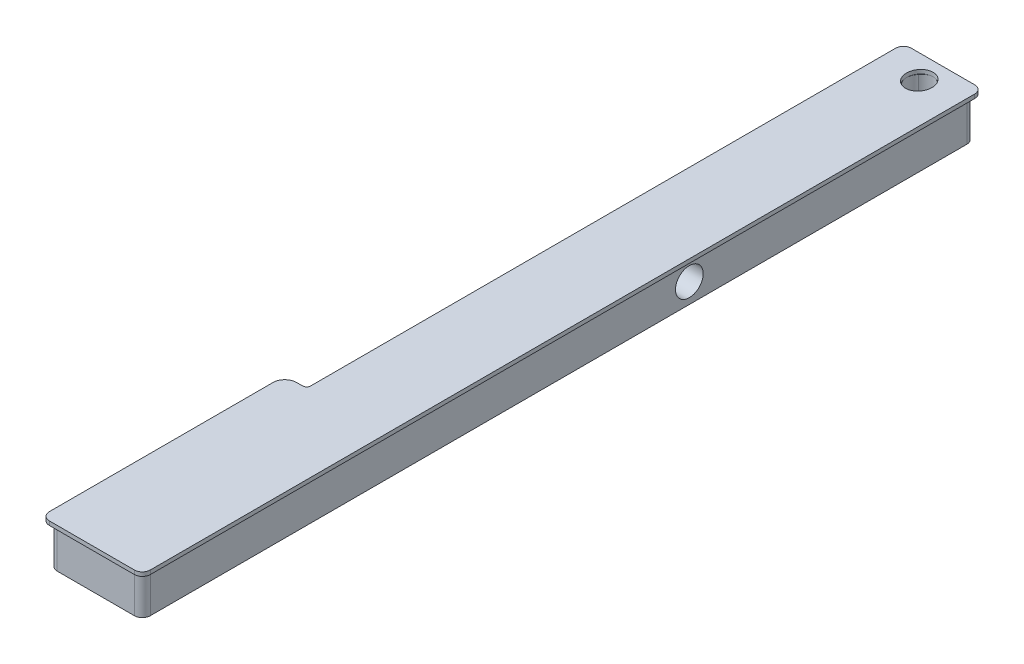
ISO-10303-21;
HEADER;
FILE_DESCRIPTION(('STEP AP214'),'2;1');
FILE_NAME('part.step','',(''),(''),'','','');
FILE_SCHEMA(('AUTOMOTIVE_DESIGN { 1 0 10303 214 1 1 1 1 }'));
ENDSEC;
DATA;
#1=APPLICATION_CONTEXT('core data for automotive mechanical design processes');
#2=APPLICATION_PROTOCOL_DEFINITION('international standard','automotive_design',2000,#1);
#3=PRODUCT_CONTEXT('',#1,'mechanical');
#4=PRODUCT('Part','Part','',(#3));
#5=PRODUCT_RELATED_PRODUCT_CATEGORY('part','',(#4));
#6=PRODUCT_DEFINITION_FORMATION('','',#4);
#7=PRODUCT_DEFINITION_CONTEXT('part definition',#1,'design');
#8=PRODUCT_DEFINITION('design','',#6,#7);
#9=PRODUCT_DEFINITION_SHAPE('','',#8);
#10=(LENGTH_UNIT() NAMED_UNIT(*) SI_UNIT(.MILLI.,.METRE.));
#11=(NAMED_UNIT(*) PLANE_ANGLE_UNIT() SI_UNIT($,.RADIAN.));
#12=(NAMED_UNIT(*) SI_UNIT($,.STERADIAN.) SOLID_ANGLE_UNIT());
#13=UNCERTAINTY_MEASURE_WITH_UNIT(LENGTH_MEASURE(1.E-05),#10,'distance_accuracy_value','');
#14=(GEOMETRIC_REPRESENTATION_CONTEXT(3) GLOBAL_UNCERTAINTY_ASSIGNED_CONTEXT((#13)) GLOBAL_UNIT_ASSIGNED_CONTEXT((#10,
#11,#12)) REPRESENTATION_CONTEXT('',''));
#15=CARTESIAN_POINT('',(0.,0.,0.));
#16=DIRECTION('',(0.,0.,1.));
#17=DIRECTION('',(1.,0.,0.));
#18=AXIS2_PLACEMENT_3D('',#15,#16,#17);
#19=CARTESIAN_POINT('',(2.35403461780498,0.,-136.));
#20=DIRECTION('',(0.,1.,0.));
#21=DIRECTION('',(0.,0.,1.));
#22=AXIS2_PLACEMENT_3D('',#19,#20,#21);
#23=CYLINDRICAL_SURFACE('',#22,3.2);
#24=CARTESIAN_POINT('',(2.35403461780498,10.,-136.));
#25=DIRECTION('',(0.,-1.,0.));
#26=DIRECTION('',(0.,0.,-1.));
#27=AXIS2_PLACEMENT_3D('',#24,#25,#26);
#28=CIRCLE('',#27,3.2);
#29=CARTESIAN_POINT('',(-0.00523515188092811,10.,-138.161907989218));
#30=VERTEX_POINT('',#29);
#31=CARTESIAN_POINT('',(-0.845965382195017,10.,-136.));
#32=VERTEX_POINT('',#31);
#33=EDGE_CURVE('E50',#30,#32,#28,.F.);
#34=ORIENTED_EDGE('',*,*,#33,.T.);
#35=CARTESIAN_POINT('',(-0.00523515188097972,10.,-133.838092010782));
#36=VERTEX_POINT('',#35);
#37=EDGE_CURVE('E11',#32,#36,#28,.F.);
#38=ORIENTED_EDGE('',*,*,#37,.T.);
#39=DIRECTION('',(0.,1.,0.));
#40=VECTOR('',#39,1.);
#41=CARTESIAN_POINT('',(-0.00523515188092594,0.,-133.838092010782));
#42=LINE('',#41,#40);
#43=CARTESIAN_POINT('',(-0.00523515188092507,0.,-133.838092010782));
#44=VERTEX_POINT('',#43);
#45=EDGE_CURVE('E273',#44,#36,#42,.T.);
#46=ORIENTED_EDGE('',*,*,#45,.F.);
#47=CARTESIAN_POINT('',(2.35403461780498,0.,-136.));
#48=DIRECTION('',(0.,1.,0.));
#49=DIRECTION('',(0.,0.,1.));
#50=AXIS2_PLACEMENT_3D('',#47,#48,#49);
#51=CIRCLE('',#50,3.2);
#52=CARTESIAN_POINT('',(-0.00523515188092637,0.,-138.161907989218));
#53=VERTEX_POINT('',#52);
#54=EDGE_CURVE('E289',#53,#44,#51,.T.);
#55=ORIENTED_EDGE('',*,*,#54,.F.);
#56=DIRECTION('',(0.,1.,0.));
#57=VECTOR('',#56,1.);
#58=CARTESIAN_POINT('',(-0.00523515188092637,0.,-138.161907989218));
#59=LINE('',#58,#57);
#60=EDGE_CURVE('E496',#30,#53,#59,.F.);
#61=ORIENTED_EDGE('',*,*,#60,.F.);
#62=EDGE_LOOP('',(#34,#38,#46,#55,#61));
#63=FACE_BOUND('',#62,.T.);
#64=ADVANCED_FACE('F41',(#63),#23,.F.);
#65=CARTESIAN_POINT('',(0.,11.,0.));
#66=DIRECTION('',(0.,1.,0.));
#67=DIRECTION('',(0.,0.,1.));
#68=AXIS2_PLACEMENT_3D('',#65,#66,#67);
#69=PLANE('',#68);
#70=CARTESIAN_POINT('',(2.35403461780498,11.,-136.));
#71=DIRECTION('',(0.,-1.,0.));
#72=DIRECTION('',(0.,0.,1.));
#73=AXIS2_PLACEMENT_3D('',#70,#71,#72);
#74=ELLIPSE('',#73,3.5,3.2);
#75=CARTESIAN_POINT('',(2.35403461780498,11.,-132.5));
#76=VERTEX_POINT('',#75);
#77=EDGE_CURVE('E252',#76,#76,#74,.F.);
#78=ORIENTED_EDGE('',*,*,#77,.F.);
#79=EDGE_LOOP('',(#78));
#80=FACE_BOUND('',#79,.T.);
#81=DIRECTION('',(0.,0.,1.));
#82=VECTOR('',#81,1.);
#83=CARTESIAN_POINT('',(-13.135965382195,11.,-142.));
#84=LINE('',#83,#82);
#85=CARTESIAN_POINT('',(-13.135965382195,11.,11.5658663131515));
#86=VERTEX_POINT('',#85);
#87=CARTESIAN_POINT('',(-13.135965382195,11.,68.));
#88=VERTEX_POINT('',#87);
#89=EDGE_CURVE('E532',#86,#88,#84,.T.);
#90=ORIENTED_EDGE('',*,*,#89,.T.);
#91=CARTESIAN_POINT('',(-11.135965382195,11.,68.));
#92=DIRECTION('',(0.,1.,0.));
#93=DIRECTION('',(0.,0.,1.));
#94=AXIS2_PLACEMENT_3D('',#91,#92,#93);
#95=CIRCLE('',#94,2.);
#96=CARTESIAN_POINT('',(-11.135965382195,11.,70.));
#97=VERTEX_POINT('',#96);
#98=EDGE_CURVE('E482',#88,#97,#95,.T.);
#99=ORIENTED_EDGE('',*,*,#98,.T.);
#100=DIRECTION('',(-1.,0.,0.));
#101=VECTOR('',#100,1.);
#102=CARTESIAN_POINT('',(12.344034617805,11.,70.));
#103=LINE('',#102,#101);
#104=CARTESIAN_POINT('',(10.344034617805,11.,70.));
#105=VERTEX_POINT('',#104);
#106=EDGE_CURVE('E536',#105,#97,#103,.T.);
#107=ORIENTED_EDGE('',*,*,#106,.F.);
#108=CARTESIAN_POINT('',(10.344034617805,11.,68.));
#109=DIRECTION('',(0.,1.,0.));
#110=DIRECTION('',(0.,0.,1.));
#111=AXIS2_PLACEMENT_3D('',#108,#109,#110);
#112=CIRCLE('',#111,2.);
#113=CARTESIAN_POINT('',(12.344034617805,11.,68.));
#114=VERTEX_POINT('',#113);
#115=EDGE_CURVE('E480',#105,#114,#112,.T.);
#116=ORIENTED_EDGE('',*,*,#115,.T.);
#117=DIRECTION('',(0.,0.,1.));
#118=VECTOR('',#117,1.);
#119=CARTESIAN_POINT('',(12.344034617805,11.,-142.));
#120=LINE('',#119,#118);
#121=CARTESIAN_POINT('',(12.344034617805,11.,-140.));
#122=VERTEX_POINT('',#121);
#123=EDGE_CURVE('E539',#122,#114,#120,.T.);
#124=ORIENTED_EDGE('',*,*,#123,.F.);
#125=CARTESIAN_POINT('',(10.344034617805,11.,-140.));
#126=DIRECTION('',(0.,1.,0.));
#127=DIRECTION('',(0.,0.,1.));
#128=AXIS2_PLACEMENT_3D('',#125,#126,#127);
#129=CIRCLE('',#128,2.);
#130=CARTESIAN_POINT('',(10.344034617805,11.,-142.));
#131=VERTEX_POINT('',#130);
#132=EDGE_CURVE('E478',#122,#131,#129,.T.);
#133=ORIENTED_EDGE('',*,*,#132,.T.);
#134=DIRECTION('',(-1.,0.,0.));
#135=VECTOR('',#134,1.);
#136=CARTESIAN_POINT('',(12.344034617805,11.,-142.));
#137=LINE('',#136,#135);
#138=CARTESIAN_POINT('',(-5.63596538219501,11.,-142.));
#139=VERTEX_POINT('',#138);
#140=EDGE_CURVE('E530',#131,#139,#137,.T.);
#141=ORIENTED_EDGE('',*,*,#140,.T.);
#142=CARTESIAN_POINT('',(-5.63596538219501,11.,-140.));
#143=DIRECTION('',(0.,1.,0.));
#144=DIRECTION('',(0.,0.,1.));
#145=AXIS2_PLACEMENT_3D('',#142,#143,#144);
#146=CIRCLE('',#145,2.);
#147=CARTESIAN_POINT('',(-7.63596538219501,11.,-140.));
#148=VERTEX_POINT('',#147);
#149=EDGE_CURVE('E57',#139,#148,#146,.T.);
#150=ORIENTED_EDGE('',*,*,#149,.T.);
#151=DIRECTION('',(0.,0.,-1.));
#152=VECTOR('',#151,1.);
#153=CARTESIAN_POINT('',(-7.63596538219501,11.,0.));
#154=LINE('',#153,#152);
#155=CARTESIAN_POINT('',(-7.63596538219501,11.,7.56586631315154));
#156=VERTEX_POINT('',#155);
#157=EDGE_CURVE('E515',#156,#148,#154,.T.);
#158=ORIENTED_EDGE('',*,*,#157,.F.);
#159=CARTESIAN_POINT('',(-8.63596538219502,11.,7.56586631315152));
#160=DIRECTION('',(0.,1.,0.));
#161=DIRECTION('',(0.,0.,1.));
#162=AXIS2_PLACEMENT_3D('',#159,#160,#161);
#163=CIRCLE('',#162,1.00000000000002);
#164=CARTESIAN_POINT('',(-8.63596538219501,11.,8.56586631315154));
#165=VERTEX_POINT('',#164);
#166=EDGE_CURVE('E522',#165,#156,#163,.T.);
#167=ORIENTED_EDGE('',*,*,#166,.F.);
#168=DIRECTION('',(1.,0.,-2.40548322002117E-13));
#169=VECTOR('',#168,1.);
#170=CARTESIAN_POINT('',(2.06050476812256E-12,11.,8.56586631314946));
#171=LINE('',#170,#169);
#172=CARTESIAN_POINT('',(-10.135965382195,11.,8.5658663131519));
#173=VERTEX_POINT('',#172);
#174=EDGE_CURVE('E524',#173,#165,#171,.T.);
#175=ORIENTED_EDGE('',*,*,#174,.F.);
#176=CARTESIAN_POINT('',(-10.1359653821954,11.,11.5658663131515));
#177=DIRECTION('',(0.,1.,0.));
#178=DIRECTION('',(0.,0.,1.));
#179=AXIS2_PLACEMENT_3D('',#176,#177,#178);
#180=CIRCLE('',#179,2.99999999999964);
#181=EDGE_CURVE('E526',#173,#86,#180,.T.);
#182=ORIENTED_EDGE('',*,*,#181,.T.);
#183=EDGE_LOOP('',(#90,#99,#107,#116,#124,#133,#141,#150,#158,#167,#175,#182));
#184=FACE_BOUND('',#183,.T.);
#185=ADVANCED_FACE('F377',(#80,#184),#69,.T.);
#186=CARTESIAN_POINT('',(0.,10.,0.));
#187=DIRECTION('',(0.,1.,0.));
#188=DIRECTION('',(0.,0.,1.));
#189=AXIS2_PLACEMENT_3D('',#186,#187,#188);
#190=PLANE('',#189);
#191=DIRECTION('',(0.,0.,1.));
#192=VECTOR('',#191,1.);
#193=CARTESIAN_POINT('',(-6.63596538219501,10.,-69.));
#194=LINE('',#193,#192);
#195=CARTESIAN_POINT('',(-6.63596538219501,10.,-139.));
#196=VERTEX_POINT('',#195);
#197=CARTESIAN_POINT('',(-6.63596538219501,10.,7.56586631315154));
#198=VERTEX_POINT('',#197);
#199=EDGE_CURVE('E706',#196,#198,#194,.T.);
#200=ORIENTED_EDGE('',*,*,#199,.T.);
#201=CARTESIAN_POINT('',(-8.63596538219501,10.,7.56586631315154));
#202=DIRECTION('',(0.,1.,0.));
#203=DIRECTION('',(0.,0.,1.));
#204=AXIS2_PLACEMENT_3D('',#201,#202,#203);
#205=CIRCLE('',#204,2.);
#206=CARTESIAN_POINT('',(-8.63596538219501,10.,9.56586631315154));
#207=VERTEX_POINT('',#206);
#208=EDGE_CURVE('E445',#198,#207,#205,.F.);
#209=ORIENTED_EDGE('',*,*,#208,.T.);
#210=DIRECTION('',(-1.,0.,0.));
#211=VECTOR('',#210,1.);
#212=CARTESIAN_POINT('',(-6.63596538219501,10.,9.56586631315154));
#213=LINE('',#212,#211);
#214=CARTESIAN_POINT('',(-10.135965382195,10.,9.56586631315154));
#215=VERTEX_POINT('',#214);
#216=EDGE_CURVE('E722',#207,#215,#213,.T.);
#217=ORIENTED_EDGE('',*,*,#216,.T.);
#218=CARTESIAN_POINT('',(-10.135965382195,10.,11.5658663131515));
#219=DIRECTION('',(0.,1.,0.));
#220=DIRECTION('',(0.,0.,1.));
#221=AXIS2_PLACEMENT_3D('',#218,#219,#220);
#222=CIRCLE('',#221,2.);
#223=CARTESIAN_POINT('',(-12.135965382195,10.,11.5658663131515));
#224=VERTEX_POINT('',#223);
#225=EDGE_CURVE('E457',#215,#224,#222,.T.);
#226=ORIENTED_EDGE('',*,*,#225,.T.);
#227=DIRECTION('',(0.,0.,1.));
#228=VECTOR('',#227,1.);
#229=CARTESIAN_POINT('',(-12.135965382195,10.,9.56586631315154));
#230=LINE('',#229,#228);
#231=CARTESIAN_POINT('',(-12.135965382195,10.,67.));
#232=VERTEX_POINT('',#231);
#233=EDGE_CURVE('E744',#224,#232,#230,.T.);
#234=ORIENTED_EDGE('',*,*,#233,.T.);
#235=CARTESIAN_POINT('',(-10.135965382195,10.,67.));
#236=DIRECTION('',(0.,1.,0.));
#237=DIRECTION('',(0.,0.,1.));
#238=AXIS2_PLACEMENT_3D('',#235,#236,#237);
#239=CIRCLE('',#238,2.);
#240=CARTESIAN_POINT('',(-10.135965382195,10.,69.));
#241=VERTEX_POINT('',#240);
#242=EDGE_CURVE('E453',#232,#241,#239,.T.);
#243=ORIENTED_EDGE('',*,*,#242,.T.);
#244=DIRECTION('',(1.,0.,0.));
#245=VECTOR('',#244,1.);
#246=CARTESIAN_POINT('',(11.344034617805,10.,69.));
#247=LINE('',#246,#245);
#248=CARTESIAN_POINT('',(9.344034617805,10.,69.));
#249=VERTEX_POINT('',#248);
#250=EDGE_CURVE('E747',#241,#249,#247,.T.);
#251=ORIENTED_EDGE('',*,*,#250,.T.);
#252=CARTESIAN_POINT('',(9.344034617805,10.,67.));
#253=DIRECTION('',(0.,1.,0.));
#254=DIRECTION('',(0.,0.,1.));
#255=AXIS2_PLACEMENT_3D('',#252,#253,#254);
#256=CIRCLE('',#255,2.);
#257=CARTESIAN_POINT('',(11.344034617805,10.,67.));
#258=VERTEX_POINT('',#257);
#259=EDGE_CURVE('E451',#249,#258,#256,.T.);
#260=ORIENTED_EDGE('',*,*,#259,.T.);
#261=DIRECTION('',(0.,0.,-1.));
#262=VECTOR('',#261,1.);
#263=CARTESIAN_POINT('',(11.344034617805,10.,-69.));
#264=LINE('',#263,#262);
#265=CARTESIAN_POINT('',(11.344034617805,10.,-139.));
#266=VERTEX_POINT('',#265);
#267=EDGE_CURVE('E752',#258,#266,#264,.T.);
#268=ORIENTED_EDGE('',*,*,#267,.T.);
#269=CARTESIAN_POINT('',(9.34403461780498,10.,-139.));
#270=DIRECTION('',(0.,1.,0.));
#271=DIRECTION('',(0.,0.,1.));
#272=AXIS2_PLACEMENT_3D('',#269,#270,#271);
#273=CIRCLE('',#272,2.);
#274=CARTESIAN_POINT('',(9.34403461780498,10.,-141.));
#275=VERTEX_POINT('',#274);
#276=EDGE_CURVE('E449',#266,#275,#273,.T.);
#277=ORIENTED_EDGE('',*,*,#276,.T.);
#278=DIRECTION('',(-1.,0.,0.));
#279=VECTOR('',#278,1.);
#280=CARTESIAN_POINT('',(-6.63596538219501,10.,-141.));
#281=LINE('',#280,#279);
#282=CARTESIAN_POINT('',(-4.63596538219502,10.,-141.));
#283=VERTEX_POINT('',#282);
#284=EDGE_CURVE('E714',#275,#283,#281,.T.);
#285=ORIENTED_EDGE('',*,*,#284,.T.);
#286=CARTESIAN_POINT('',(-4.63596538219502,10.,-139.));
#287=DIRECTION('',(0.,1.,0.));
#288=DIRECTION('',(0.,0.,1.));
#289=AXIS2_PLACEMENT_3D('',#286,#287,#288);
#290=CIRCLE('',#289,2.);
#291=EDGE_CURVE('E447',#283,#196,#290,.T.);
#292=ORIENTED_EDGE('',*,*,#291,.T.);
#293=EDGE_LOOP('',(#200,#209,#217,#226,#234,#243,#251,#260,#268,#277,#285,#292));
#294=FACE_BOUND('',#293,.T.);
#295=DIRECTION('',(-1.,0.,0.));
#296=VECTOR('',#295,1.);
#297=CARTESIAN_POINT('',(12.344034617805,10.,70.));
#298=LINE('',#297,#296);
#299=CARTESIAN_POINT('',(10.344034617805,10.,70.));
#300=VERTEX_POINT('',#299);
#301=CARTESIAN_POINT('',(-11.135965382195,10.,70.));
#302=VERTEX_POINT('',#301);
#303=EDGE_CURVE('E547',#300,#302,#298,.T.);
#304=ORIENTED_EDGE('',*,*,#303,.T.);
#305=CARTESIAN_POINT('',(-11.135965382195,10.,68.));
#306=DIRECTION('',(0.,1.,0.));
#307=DIRECTION('',(0.,0.,1.));
#308=AXIS2_PLACEMENT_3D('',#305,#306,#307);
#309=CIRCLE('',#308,2.);
#310=CARTESIAN_POINT('',(-13.135965382195,10.,68.));
#311=VERTEX_POINT('',#310);
#312=EDGE_CURVE('E473',#302,#311,#309,.F.);
#313=ORIENTED_EDGE('',*,*,#312,.T.);
#314=DIRECTION('',(0.,0.,1.));
#315=VECTOR('',#314,1.);
#316=CARTESIAN_POINT('',(-13.135965382195,10.,-142.));
#317=LINE('',#316,#315);
#318=CARTESIAN_POINT('',(-13.135965382195,10.,11.5658663131515));
#319=VERTEX_POINT('',#318);
#320=EDGE_CURVE('E544',#319,#311,#317,.T.);
#321=ORIENTED_EDGE('',*,*,#320,.F.);
#322=CARTESIAN_POINT('',(-10.1359653821954,10.,11.5658663131515));
#323=DIRECTION('',(0.,-1.,0.));
#324=DIRECTION('',(0.,0.,-1.));
#325=AXIS2_PLACEMENT_3D('',#322,#323,#324);
#326=CIRCLE('',#325,2.99999999999964);
#327=CARTESIAN_POINT('',(-10.135965382195,10.,8.5658663131519));
#328=VERTEX_POINT('',#327);
#329=EDGE_CURVE('E508',#319,#328,#326,.T.);
#330=ORIENTED_EDGE('',*,*,#329,.T.);
#331=DIRECTION('',(-1.,0.,2.40548322002117E-13));
#332=VECTOR('',#331,1.);
#333=CARTESIAN_POINT('',(-8.63596538219501,10.,8.56586631315154));
#334=LINE('',#333,#332);
#335=CARTESIAN_POINT('',(-8.63596538219501,10.,8.56586631315154));
#336=VERTEX_POINT('',#335);
#337=EDGE_CURVE('E505',#336,#328,#334,.T.);
#338=ORIENTED_EDGE('',*,*,#337,.F.);
#339=CARTESIAN_POINT('',(-8.63596538219502,10.,7.56586631315152));
#340=DIRECTION('',(0.,-1.,0.));
#341=DIRECTION('',(0.,0.,-1.));
#342=AXIS2_PLACEMENT_3D('',#339,#340,#341);
#343=CIRCLE('',#342,1.00000000000002);
#344=CARTESIAN_POINT('',(-7.63596538219501,10.,7.56586631315154));
#345=VERTEX_POINT('',#344);
#346=EDGE_CURVE('E251',#345,#336,#343,.T.);
#347=ORIENTED_EDGE('',*,*,#346,.F.);
#348=DIRECTION('',(0.,0.,-1.));
#349=VECTOR('',#348,1.);
#350=CARTESIAN_POINT('',(-7.63596538219501,10.,0.));
#351=LINE('',#350,#349);
#352=CARTESIAN_POINT('',(-7.63596538219501,10.,-140.));
#353=VERTEX_POINT('',#352);
#354=EDGE_CURVE('E459',#345,#353,#351,.T.);
#355=ORIENTED_EDGE('',*,*,#354,.T.);
#356=CARTESIAN_POINT('',(-5.63596538219501,10.,-140.));
#357=DIRECTION('',(0.,1.,0.));
#358=DIRECTION('',(0.,0.,1.));
#359=AXIS2_PLACEMENT_3D('',#356,#357,#358);
#360=CIRCLE('',#359,2.);
#361=CARTESIAN_POINT('',(-5.63596538219501,10.,-142.));
#362=VERTEX_POINT('',#361);
#363=EDGE_CURVE('E467',#353,#362,#360,.F.);
#364=ORIENTED_EDGE('',*,*,#363,.T.);
#365=DIRECTION('',(-1.,0.,0.));
#366=VECTOR('',#365,1.);
#367=CARTESIAN_POINT('',(12.344034617805,10.,-142.));
#368=LINE('',#367,#366);
#369=CARTESIAN_POINT('',(10.344034617805,10.,-142.));
#370=VERTEX_POINT('',#369);
#371=EDGE_CURVE('E529',#370,#362,#368,.T.);
#372=ORIENTED_EDGE('',*,*,#371,.F.);
#373=CARTESIAN_POINT('',(10.344034617805,10.,-140.));
#374=DIRECTION('',(0.,1.,0.));
#375=DIRECTION('',(0.,0.,1.));
#376=AXIS2_PLACEMENT_3D('',#373,#374,#375);
#377=CIRCLE('',#376,2.);
#378=CARTESIAN_POINT('',(12.344034617805,10.,-140.));
#379=VERTEX_POINT('',#378);
#380=EDGE_CURVE('E469',#370,#379,#377,.F.);
#381=ORIENTED_EDGE('',*,*,#380,.T.);
#382=DIRECTION('',(0.,0.,1.));
#383=VECTOR('',#382,1.);
#384=CARTESIAN_POINT('',(12.344034617805,10.,-142.));
#385=LINE('',#384,#383);
#386=CARTESIAN_POINT('',(12.344034617805,10.,68.));
#387=VERTEX_POINT('',#386);
#388=EDGE_CURVE('E533',#379,#387,#385,.T.);
#389=ORIENTED_EDGE('',*,*,#388,.T.);
#390=CARTESIAN_POINT('',(10.344034617805,10.,68.));
#391=DIRECTION('',(0.,1.,0.));
#392=DIRECTION('',(0.,0.,1.));
#393=AXIS2_PLACEMENT_3D('',#390,#391,#392);
#394=CIRCLE('',#393,2.);
#395=EDGE_CURVE('E471',#387,#300,#394,.F.);
#396=ORIENTED_EDGE('',*,*,#395,.T.);
#397=EDGE_LOOP('',(#304,#313,#321,#330,#338,#347,#355,#364,#372,#381,#389,#396));
#398=FACE_BOUND('',#397,.T.);
#399=ADVANCED_FACE('F382',(#294,#398),#190,.F.);
#400=CARTESIAN_POINT('',(2.35403461780498,0.,-136.));
#401=DIRECTION('',(0.,1.,0.));
#402=DIRECTION('',(0.,0.,-1.));
#403=AXIS2_PLACEMENT_3D('',#400,#401,#402);
#404=ELLIPSE('',#403,3.5,3.);
#405=DIRECTION('',(0.,1.,0.));
#406=VECTOR('',#405,1.);
#407=SURFACE_OF_LINEAR_EXTRUSION('',#404,#406);
#408=CARTESIAN_POINT('',(2.35403461780498,10.,-136.));
#409=DIRECTION('',(0.,1.,0.));
#410=DIRECTION('',(0.,0.,-1.));
#411=AXIS2_PLACEMENT_3D('',#408,#409,#410);
#412=ELLIPSE('',#411,3.5,3.);
#413=CARTESIAN_POINT('',(2.35403461780498,10.,-132.5));
#414=VERTEX_POINT('',#413);
#415=EDGE_CURVE('E267',#36,#414,#412,.T.);
#416=ORIENTED_EDGE('',*,*,#415,.T.);
#417=CARTESIAN_POINT('',(2.35403461780498,10.,-136.));
#418=DIRECTION('',(0.,1.,0.));
#419=DIRECTION('',(0.,0.,-1.));
#420=AXIS2_PLACEMENT_3D('',#417,#418,#419);
#421=ELLIPSE('',#420,3.5,3.);
#422=CARTESIAN_POINT('',(4.7133043874909,10.,-133.838092010782));
#423=VERTEX_POINT('',#422);
#424=EDGE_CURVE('E240',#414,#423,#421,.T.);
#425=ORIENTED_EDGE('',*,*,#424,.T.);
#426=DIRECTION('',(0.,1.,0.));
#427=VECTOR('',#426,1.);
#428=CARTESIAN_POINT('',(4.7133043874909,0.,-133.838092010782));
#429=LINE('',#428,#427);
#430=CARTESIAN_POINT('',(4.7133043874909,0.,-133.838092010782));
#431=VERTEX_POINT('',#430);
#432=EDGE_CURVE('E395',#423,#431,#429,.F.);
#433=ORIENTED_EDGE('',*,*,#432,.T.);
#434=EDGE_CURVE('E279',#44,#431,#404,.T.);
#435=ORIENTED_EDGE('',*,*,#434,.F.);
#436=ORIENTED_EDGE('',*,*,#45,.T.);
#437=EDGE_LOOP('',(#416,#425,#433,#435,#436));
#438=FACE_BOUND('',#437,.T.);
#439=ADVANCED_FACE('F271',(#438),#407,.F.);
#440=CARTESIAN_POINT('',(-6.63596538219501,10.,9.56586631315154));
#441=DIRECTION('',(0.,0.,1.));
#442=DIRECTION('',(1.,0.,0.));
#443=AXIS2_PLACEMENT_3D('',#440,#441,#442);
#444=PLANE('',#443);
#445=ORIENTED_EDGE('',*,*,#216,.F.);
#446=DIRECTION('',(0.,-1.,0.));
#447=VECTOR('',#446,1.);
#448=CARTESIAN_POINT('',(-8.63596538219501,0.,9.56586631315154));
#449=LINE('',#448,#447);
#450=CARTESIAN_POINT('',(-8.63596538219501,0.,9.56586631315154));
#451=VERTEX_POINT('',#450);
#452=EDGE_CURVE('E442',#207,#451,#449,.T.);
#453=ORIENTED_EDGE('',*,*,#452,.T.);
#454=DIRECTION('',(-1.,0.,0.));
#455=VECTOR('',#454,1.);
#456=CARTESIAN_POINT('',(-6.63596538219501,0.,9.56586631315154));
#457=LINE('',#456,#455);
#458=CARTESIAN_POINT('',(-10.135965382195,0.,9.56586631315154));
#459=VERTEX_POINT('',#458);
#460=EDGE_CURVE('E720',#451,#459,#457,.T.);
#461=ORIENTED_EDGE('',*,*,#460,.T.);
#462=DIRECTION('',(0.,-1.,0.));
#463=VECTOR('',#462,1.);
#464=CARTESIAN_POINT('',(-10.135965382195,10.,9.56586631315154));
#465=LINE('',#464,#463);
#466=EDGE_CURVE('E440',#459,#215,#465,.F.);
#467=ORIENTED_EDGE('',*,*,#466,.T.);
#468=EDGE_LOOP('',(#445,#453,#461,#467));
#469=FACE_BOUND('',#468,.T.);
#470=ADVANCED_FACE('F329',(#469),#444,.F.);
#471=CARTESIAN_POINT('',(-12.135965382195,10.,9.56586631315154));
#472=DIRECTION('',(1.,0.,0.));
#473=DIRECTION('',(0.,0.,-1.));
#474=AXIS2_PLACEMENT_3D('',#471,#472,#473);
#475=PLANE('',#474);
#476=DIRECTION('',(0.,0.,1.));
#477=VECTOR('',#476,1.);
#478=CARTESIAN_POINT('',(-12.135965382195,0.,9.56586631315154));
#479=LINE('',#478,#477);
#480=CARTESIAN_POINT('',(-12.135965382195,0.,11.5658663131515));
#481=VERTEX_POINT('',#480);
#482=CARTESIAN_POINT('',(-12.135965382195,0.,67.));
#483=VERTEX_POINT('',#482);
#484=EDGE_CURVE('E727',#481,#483,#479,.T.);
#485=ORIENTED_EDGE('',*,*,#484,.T.);
#486=DIRECTION('',(0.,-1.,0.));
#487=VECTOR('',#486,1.);
#488=CARTESIAN_POINT('',(-12.135965382195,10.,67.));
#489=LINE('',#488,#487);
#490=EDGE_CURVE('E438',#483,#232,#489,.F.);
#491=ORIENTED_EDGE('',*,*,#490,.T.);
#492=ORIENTED_EDGE('',*,*,#233,.F.);
#493=DIRECTION('',(0.,-1.,0.));
#494=VECTOR('',#493,1.);
#495=CARTESIAN_POINT('',(-12.135965382195,10.,11.5658663131515));
#496=LINE('',#495,#494);
#497=EDGE_CURVE('E435',#224,#481,#496,.T.);
#498=ORIENTED_EDGE('',*,*,#497,.T.);
#499=EDGE_LOOP('',(#485,#491,#492,#498));
#500=FACE_BOUND('',#499,.T.);
#501=ADVANCED_FACE('F325',(#500),#475,.F.);
#502=CARTESIAN_POINT('',(11.344034617805,10.,69.));
#503=DIRECTION('',(0.,0.,-1.));
#504=DIRECTION('',(-1.,0.,0.));
#505=AXIS2_PLACEMENT_3D('',#502,#503,#504);
#506=PLANE('',#505);
#507=DIRECTION('',(1.,0.,0.));
#508=VECTOR('',#507,1.);
#509=CARTESIAN_POINT('',(11.344034617805,0.,69.));
#510=LINE('',#509,#508);
#511=CARTESIAN_POINT('',(-10.135965382195,0.,69.));
#512=VERTEX_POINT('',#511);
#513=CARTESIAN_POINT('',(9.344034617805,0.,69.));
#514=VERTEX_POINT('',#513);
#515=EDGE_CURVE('E730',#512,#514,#510,.T.);
#516=ORIENTED_EDGE('',*,*,#515,.T.);
#517=DIRECTION('',(0.,-1.,0.));
#518=VECTOR('',#517,1.);
#519=CARTESIAN_POINT('',(9.344034617805,10.,69.));
#520=LINE('',#519,#518);
#521=EDGE_CURVE('E433',#514,#249,#520,.F.);
#522=ORIENTED_EDGE('',*,*,#521,.T.);
#523=ORIENTED_EDGE('',*,*,#250,.F.);
#524=DIRECTION('',(0.,-1.,0.));
#525=VECTOR('',#524,1.);
#526=CARTESIAN_POINT('',(-10.135965382195,10.,69.));
#527=LINE('',#526,#525);
#528=EDGE_CURVE('E430',#241,#512,#527,.T.);
#529=ORIENTED_EDGE('',*,*,#528,.T.);
#530=EDGE_LOOP('',(#516,#522,#523,#529));
#531=FACE_BOUND('',#530,.T.);
#532=ADVANCED_FACE('F321',(#531),#506,.F.);
#533=CARTESIAN_POINT('',(11.344034617805,10.,-141.));
#534=DIRECTION('',(-1.,0.,0.));
#535=DIRECTION('',(0.,0.,1.));
#536=AXIS2_PLACEMENT_3D('',#533,#534,#535);
#537=PLANE('',#536);
#538=CARTESIAN_POINT('',(11.344034617805,4.99999999999999,-69.));
#539=DIRECTION('',(1.,0.,0.));
#540=DIRECTION('',(0.,0.,-1.));
#541=AXIS2_PLACEMENT_3D('',#538,#539,#540);
#542=CIRCLE('',#541,3.50000000000001);
#543=CARTESIAN_POINT('',(11.344034617805,4.99999999999999,-72.5));
#544=VERTEX_POINT('',#543);
#545=EDGE_CURVE('E297',#544,#544,#542,.T.);
#546=ORIENTED_EDGE('',*,*,#545,.F.);
#547=EDGE_LOOP('',(#546));
#548=FACE_BOUND('',#547,.T.);
#549=DIRECTION('',(0.,0.,-1.));
#550=VECTOR('',#549,1.);
#551=CARTESIAN_POINT('',(11.344034617805,0.,-141.));
#552=LINE('',#551,#550);
#553=CARTESIAN_POINT('',(11.344034617805,0.,67.));
#554=VERTEX_POINT('',#553);
#555=CARTESIAN_POINT('',(11.344034617805,0.,-139.));
#556=VERTEX_POINT('',#555);
#557=EDGE_CURVE('E736',#554,#556,#552,.T.);
#558=ORIENTED_EDGE('',*,*,#557,.T.);
#559=DIRECTION('',(0.,-1.,0.));
#560=VECTOR('',#559,1.);
#561=CARTESIAN_POINT('',(11.344034617805,10.,-139.));
#562=LINE('',#561,#560);
#563=EDGE_CURVE('E428',#556,#266,#562,.F.);
#564=ORIENTED_EDGE('',*,*,#563,.T.);
#565=ORIENTED_EDGE('',*,*,#267,.F.);
#566=DIRECTION('',(0.,-1.,0.));
#567=VECTOR('',#566,1.);
#568=CARTESIAN_POINT('',(11.344034617805,10.,67.));
#569=LINE('',#568,#567);
#570=EDGE_CURVE('E425',#258,#554,#569,.T.);
#571=ORIENTED_EDGE('',*,*,#570,.T.);
#572=EDGE_LOOP('',(#558,#564,#565,#571));
#573=FACE_BOUND('',#572,.T.);
#574=ADVANCED_FACE('F317',(#548,#573),#537,.F.);
#575=CARTESIAN_POINT('',(-6.63596538219501,10.,-141.));
#576=DIRECTION('',(0.,0.,1.));
#577=DIRECTION('',(1.,0.,0.));
#578=AXIS2_PLACEMENT_3D('',#575,#576,#577);
#579=PLANE('',#578);
#580=DIRECTION('',(-1.,0.,0.));
#581=VECTOR('',#580,1.);
#582=CARTESIAN_POINT('',(-6.63596538219501,0.,-141.));
#583=LINE('',#582,#581);
#584=CARTESIAN_POINT('',(9.34403461780498,0.,-141.));
#585=VERTEX_POINT('',#584);
#586=CARTESIAN_POINT('',(-4.63596538219502,0.,-141.));
#587=VERTEX_POINT('',#586);
#588=EDGE_CURVE('E739',#585,#587,#583,.T.);
#589=ORIENTED_EDGE('',*,*,#588,.T.);
#590=DIRECTION('',(0.,-1.,0.));
#591=VECTOR('',#590,1.);
#592=CARTESIAN_POINT('',(-4.63596538219502,10.,-141.));
#593=LINE('',#592,#591);
#594=EDGE_CURVE('E423',#587,#283,#593,.F.);
#595=ORIENTED_EDGE('',*,*,#594,.T.);
#596=ORIENTED_EDGE('',*,*,#284,.F.);
#597=DIRECTION('',(0.,-1.,0.));
#598=VECTOR('',#597,1.);
#599=CARTESIAN_POINT('',(9.34403461780498,10.,-141.));
#600=LINE('',#599,#598);
#601=EDGE_CURVE('E420',#275,#585,#600,.T.);
#602=ORIENTED_EDGE('',*,*,#601,.T.);
#603=EDGE_LOOP('',(#589,#595,#596,#602));
#604=FACE_BOUND('',#603,.T.);
#605=ADVANCED_FACE('F313',(#604),#579,.F.);
#606=CARTESIAN_POINT('',(-6.63596538219501,10.,-69.));
#607=DIRECTION('',(1.,0.,0.));
#608=DIRECTION('',(0.,0.,-1.));
#609=AXIS2_PLACEMENT_3D('',#606,#607,#608);
#610=PLANE('',#609);
#611=CARTESIAN_POINT('',(-6.63596538219502,4.99999999999999,-69.));
#612=DIRECTION('',(1.,0.,0.));
#613=DIRECTION('',(0.,0.,-1.));
#614=AXIS2_PLACEMENT_3D('',#611,#612,#613);
#615=CIRCLE('',#614,3.50000000000001);
#616=CARTESIAN_POINT('',(-6.63596538219502,4.99999999999999,-72.5));
#617=VERTEX_POINT('',#616);
#618=EDGE_CURVE('E295',#617,#617,#615,.T.);
#619=ORIENTED_EDGE('',*,*,#618,.T.);
#620=EDGE_LOOP('',(#619));
#621=FACE_BOUND('',#620,.T.);
#622=ORIENTED_EDGE('',*,*,#199,.F.);
#623=DIRECTION('',(0.,-1.,0.));
#624=VECTOR('',#623,1.);
#625=CARTESIAN_POINT('',(-6.63596538219502,10.,-139.));
#626=LINE('',#625,#624);
#627=CARTESIAN_POINT('',(-6.63596538219502,0.,-139.));
#628=VERTEX_POINT('',#627);
#629=EDGE_CURVE('E400',#196,#628,#626,.T.);
#630=ORIENTED_EDGE('',*,*,#629,.T.);
#631=DIRECTION('',(0.,0.,1.));
#632=VECTOR('',#631,1.);
#633=CARTESIAN_POINT('',(-6.63596538219501,0.,-69.));
#634=LINE('',#633,#632);
#635=CARTESIAN_POINT('',(-6.63596538219501,0.,7.56586631315154));
#636=VERTEX_POINT('',#635);
#637=EDGE_CURVE('E742',#628,#636,#634,.T.);
#638=ORIENTED_EDGE('',*,*,#637,.T.);
#639=DIRECTION('',(0.,-1.,0.));
#640=VECTOR('',#639,1.);
#641=CARTESIAN_POINT('',(-6.63596538219501,10.,7.56586631315154));
#642=LINE('',#641,#640);
#643=EDGE_CURVE('E397',#636,#198,#642,.F.);
#644=ORIENTED_EDGE('',*,*,#643,.T.);
#645=EDGE_LOOP('',(#622,#630,#638,#644));
#646=FACE_BOUND('',#645,.T.);
#647=ADVANCED_FACE('F310',(#621,#646),#610,.F.);
#648=CARTESIAN_POINT('',(0.,0.,0.));
#649=DIRECTION('',(0.,1.,0.));
#650=DIRECTION('',(0.,0.,1.));
#651=AXIS2_PLACEMENT_3D('',#648,#649,#650);
#652=PLANE('',#651);
#653=ORIENTED_EDGE('',*,*,#434,.T.);
#654=CARTESIAN_POINT('',(4.7133043874909,0.,-138.161907989218));
#655=VERTEX_POINT('',#654);
#656=EDGE_CURVE('E284',#431,#655,#51,.T.);
#657=ORIENTED_EDGE('',*,*,#656,.T.);
#658=EDGE_CURVE('E274',#655,#53,#404,.T.);
#659=ORIENTED_EDGE('',*,*,#658,.T.);
#660=ORIENTED_EDGE('',*,*,#54,.T.);
#661=EDGE_LOOP('',(#653,#657,#659,#660));
#662=FACE_BOUND('',#661,.T.);
#663=ORIENTED_EDGE('',*,*,#637,.F.);
#664=CARTESIAN_POINT('',(-4.63596538219502,0.,-139.));
#665=DIRECTION('',(0.,1.,0.));
#666=DIRECTION('',(0.,0.,1.));
#667=AXIS2_PLACEMENT_3D('',#664,#665,#666);
#668=CIRCLE('',#667,2.);
#669=EDGE_CURVE('E418',#628,#587,#668,.F.);
#670=ORIENTED_EDGE('',*,*,#669,.T.);
#671=ORIENTED_EDGE('',*,*,#588,.F.);
#672=CARTESIAN_POINT('',(9.34403461780498,0.,-139.));
#673=DIRECTION('',(0.,1.,0.));
#674=DIRECTION('',(0.,0.,1.));
#675=AXIS2_PLACEMENT_3D('',#672,#673,#674);
#676=CIRCLE('',#675,2.);
#677=EDGE_CURVE('E416',#585,#556,#676,.F.);
#678=ORIENTED_EDGE('',*,*,#677,.T.);
#679=ORIENTED_EDGE('',*,*,#557,.F.);
#680=CARTESIAN_POINT('',(9.344034617805,0.,67.));
#681=DIRECTION('',(0.,1.,0.));
#682=DIRECTION('',(0.,0.,1.));
#683=AXIS2_PLACEMENT_3D('',#680,#681,#682);
#684=CIRCLE('',#683,2.);
#685=EDGE_CURVE('E414',#554,#514,#684,.F.);
#686=ORIENTED_EDGE('',*,*,#685,.T.);
#687=ORIENTED_EDGE('',*,*,#515,.F.);
#688=CARTESIAN_POINT('',(-10.135965382195,0.,67.));
#689=DIRECTION('',(0.,1.,0.));
#690=DIRECTION('',(0.,0.,1.));
#691=AXIS2_PLACEMENT_3D('',#688,#689,#690);
#692=CIRCLE('',#691,2.);
#693=EDGE_CURVE('E412',#512,#483,#692,.F.);
#694=ORIENTED_EDGE('',*,*,#693,.T.);
#695=ORIENTED_EDGE('',*,*,#484,.F.);
#696=CARTESIAN_POINT('',(-10.135965382195,0.,11.5658663131515));
#697=DIRECTION('',(0.,1.,0.));
#698=DIRECTION('',(0.,0.,1.));
#699=AXIS2_PLACEMENT_3D('',#696,#697,#698);
#700=CIRCLE('',#699,2.);
#701=EDGE_CURVE('E410',#481,#459,#700,.F.);
#702=ORIENTED_EDGE('',*,*,#701,.T.);
#703=ORIENTED_EDGE('',*,*,#460,.F.);
#704=CARTESIAN_POINT('',(-8.63596538219501,0.,7.56586631315154));
#705=DIRECTION('',(0.,1.,0.));
#706=DIRECTION('',(0.,0.,1.));
#707=AXIS2_PLACEMENT_3D('',#704,#705,#706);
#708=CIRCLE('',#707,2.);
#709=EDGE_CURVE('E455',#451,#636,#708,.T.);
#710=ORIENTED_EDGE('',*,*,#709,.T.);
#711=EDGE_LOOP('',(#663,#670,#671,#678,#679,#686,#687,#694,#695,#702,#703,#710));
#712=FACE_BOUND('',#711,.T.);
#713=ADVANCED_FACE('F306',(#662,#712),#652,.F.);
#714=ORIENTED_EDGE('',*,*,#658,.F.);
#715=DIRECTION('',(0.,1.,0.));
#716=VECTOR('',#715,1.);
#717=CARTESIAN_POINT('',(4.7133043874909,0.,-138.161907989218));
#718=LINE('',#717,#716);
#719=CARTESIAN_POINT('',(4.71330438749092,10.,-138.161907989218));
#720=VERTEX_POINT('',#719);
#721=EDGE_CURVE('E398',#655,#720,#718,.T.);
#722=ORIENTED_EDGE('',*,*,#721,.T.);
#723=CARTESIAN_POINT('',(2.35403461780498,10.,-139.5));
#724=VERTEX_POINT('',#723);
#725=EDGE_CURVE('E275',#720,#724,#412,.T.);
#726=ORIENTED_EDGE('',*,*,#725,.T.);
#727=EDGE_CURVE('E277',#724,#30,#412,.T.);
#728=ORIENTED_EDGE('',*,*,#727,.T.);
#729=ORIENTED_EDGE('',*,*,#60,.T.);
#730=EDGE_LOOP('',(#714,#722,#726,#728,#729));
#731=FACE_BOUND('',#730,.T.);
#732=ADVANCED_FACE('F301',(#731),#407,.F.);
#733=ORIENTED_EDGE('',*,*,#432,.F.);
#734=CARTESIAN_POINT('',(5.55403461780499,10.,-136.));
#735=VERTEX_POINT('',#734);
#736=EDGE_CURVE('E246',#423,#735,#28,.F.);
#737=ORIENTED_EDGE('',*,*,#736,.T.);
#738=EDGE_CURVE('E45',#735,#720,#28,.F.);
#739=ORIENTED_EDGE('',*,*,#738,.T.);
#740=ORIENTED_EDGE('',*,*,#721,.F.);
#741=ORIENTED_EDGE('',*,*,#656,.F.);
#742=EDGE_LOOP('',(#733,#737,#739,#740,#741));
#743=FACE_BOUND('',#742,.T.);
#744=ADVANCED_FACE('F305',(#743),#23,.F.);
#745=CARTESIAN_POINT('',(-31.655965382195,4.99999999999999,-69.));
#746=DIRECTION('',(1.,0.,0.));
#747=DIRECTION('',(0.,0.,-1.));
#748=AXIS2_PLACEMENT_3D('',#745,#746,#747);
#749=CYLINDRICAL_SURFACE('',#748,3.50000000000001);
#750=ORIENTED_EDGE('',*,*,#545,.T.);
#751=EDGE_LOOP('',(#750));
#752=FACE_BOUND('',#751,.T.);
#753=ORIENTED_EDGE('',*,*,#618,.F.);
#754=EDGE_LOOP('',(#753));
#755=FACE_BOUND('',#754,.T.);
#756=ADVANCED_FACE('F386',(#752,#755),#749,.F.);
#757=CARTESIAN_POINT('',(12.344034617805,11.,-142.));
#758=DIRECTION('',(1.,0.,0.));
#759=DIRECTION('',(0.,0.,-1.));
#760=AXIS2_PLACEMENT_3D('',#757,#758,#759);
#761=PLANE('',#760);
#762=ORIENTED_EDGE('',*,*,#123,.T.);
#763=DIRECTION('',(0.,-1.,0.));
#764=VECTOR('',#763,1.);
#765=CARTESIAN_POINT('',(12.344034617805,11.,68.));
#766=LINE('',#765,#764);
#767=EDGE_CURVE('E486',#114,#387,#766,.T.);
#768=ORIENTED_EDGE('',*,*,#767,.T.);
#769=ORIENTED_EDGE('',*,*,#388,.F.);
#770=DIRECTION('',(0.,-1.,0.));
#771=VECTOR('',#770,1.);
#772=CARTESIAN_POINT('',(12.344034617805,11.,-140.));
#773=LINE('',#772,#771);
#774=EDGE_CURVE('E484',#379,#122,#773,.F.);
#775=ORIENTED_EDGE('',*,*,#774,.T.);
#776=EDGE_LOOP('',(#762,#768,#769,#775));
#777=FACE_BOUND('',#776,.T.);
#778=ADVANCED_FACE('F393',(#777),#761,.T.);
#779=CARTESIAN_POINT('',(12.344034617805,11.,70.));
#780=DIRECTION('',(0.,0.,1.));
#781=DIRECTION('',(1.,0.,0.));
#782=AXIS2_PLACEMENT_3D('',#779,#780,#781);
#783=PLANE('',#782);
#784=ORIENTED_EDGE('',*,*,#106,.T.);
#785=DIRECTION('',(0.,-1.,0.));
#786=VECTOR('',#785,1.);
#787=CARTESIAN_POINT('',(-11.135965382195,10.,70.));
#788=LINE('',#787,#786);
#789=EDGE_CURVE('E464',#97,#302,#788,.T.);
#790=ORIENTED_EDGE('',*,*,#789,.T.);
#791=ORIENTED_EDGE('',*,*,#303,.F.);
#792=DIRECTION('',(0.,-1.,0.));
#793=VECTOR('',#792,1.);
#794=CARTESIAN_POINT('',(10.344034617805,11.,70.));
#795=LINE('',#794,#793);
#796=EDGE_CURVE('E462',#300,#105,#795,.F.);
#797=ORIENTED_EDGE('',*,*,#796,.T.);
#798=EDGE_LOOP('',(#784,#790,#791,#797));
#799=FACE_BOUND('',#798,.T.);
#800=ADVANCED_FACE('F584',(#799),#783,.T.);
#801=CARTESIAN_POINT('',(-13.135965382195,11.,-142.));
#802=DIRECTION('',(1.,0.,0.));
#803=DIRECTION('',(0.,0.,-1.));
#804=AXIS2_PLACEMENT_3D('',#801,#802,#803);
#805=PLANE('',#804);
#806=ORIENTED_EDGE('',*,*,#320,.T.);
#807=DIRECTION('',(0.,-1.,0.));
#808=VECTOR('',#807,1.);
#809=CARTESIAN_POINT('',(-13.135965382195,11.,68.));
#810=LINE('',#809,#808);
#811=EDGE_CURVE('E475',#311,#88,#810,.F.);
#812=ORIENTED_EDGE('',*,*,#811,.T.);
#813=ORIENTED_EDGE('',*,*,#89,.F.);
#814=DIRECTION('',(0.,-1.,0.));
#815=VECTOR('',#814,1.);
#816=CARTESIAN_POINT('',(-13.135965382195,20.,11.5658663131515));
#817=LINE('',#816,#815);
#818=EDGE_CURVE('E512',#86,#319,#817,.T.);
#819=ORIENTED_EDGE('',*,*,#818,.T.);
#820=EDGE_LOOP('',(#806,#812,#813,#819));
#821=FACE_BOUND('',#820,.T.);
#822=ADVANCED_FACE('F577',(#821),#805,.F.);
#823=CARTESIAN_POINT('',(12.344034617805,11.,-142.));
#824=DIRECTION('',(0.,0.,1.));
#825=DIRECTION('',(1.,0.,0.));
#826=AXIS2_PLACEMENT_3D('',#823,#824,#825);
#827=PLANE('',#826);
#828=ORIENTED_EDGE('',*,*,#140,.F.);
#829=DIRECTION('',(0.,-1.,0.));
#830=VECTOR('',#829,1.);
#831=CARTESIAN_POINT('',(10.344034617805,10.,-142.));
#832=LINE('',#831,#830);
#833=EDGE_CURVE('E491',#131,#370,#832,.T.);
#834=ORIENTED_EDGE('',*,*,#833,.T.);
#835=ORIENTED_EDGE('',*,*,#371,.T.);
#836=DIRECTION('',(0.,1.,0.));
#837=VECTOR('',#836,1.);
#838=CARTESIAN_POINT('',(-5.63596538219501,11.,-142.));
#839=LINE('',#838,#837);
#840=EDGE_CURVE('E489',#362,#139,#839,.T.);
#841=ORIENTED_EDGE('',*,*,#840,.T.);
#842=EDGE_LOOP('',(#828,#834,#835,#841));
#843=FACE_BOUND('',#842,.T.);
#844=ADVANCED_FACE('F338',(#843),#827,.F.);
#845=CARTESIAN_POINT('',(-4.63596538219502,10.,-139.));
#846=DIRECTION('',(0.,-1.,0.));
#847=DIRECTION('',(0.,0.,-1.));
#848=AXIS2_PLACEMENT_3D('',#845,#846,#847);
#849=CYLINDRICAL_SURFACE('',#848,2.);
#850=ORIENTED_EDGE('',*,*,#291,.F.);
#851=ORIENTED_EDGE('',*,*,#594,.F.);
#852=ORIENTED_EDGE('',*,*,#669,.F.);
#853=ORIENTED_EDGE('',*,*,#629,.F.);
#854=EDGE_LOOP('',(#850,#851,#852,#853));
#855=FACE_BOUND('',#854,.T.);
#856=ADVANCED_FACE('F334',(#855),#849,.T.);
#857=CARTESIAN_POINT('',(9.34403461780498,10.,-139.));
#858=DIRECTION('',(0.,-1.,0.));
#859=DIRECTION('',(0.,0.,-1.));
#860=AXIS2_PLACEMENT_3D('',#857,#858,#859);
#861=CYLINDRICAL_SURFACE('',#860,2.);
#862=ORIENTED_EDGE('',*,*,#276,.F.);
#863=ORIENTED_EDGE('',*,*,#563,.F.);
#864=ORIENTED_EDGE('',*,*,#677,.F.);
#865=ORIENTED_EDGE('',*,*,#601,.F.);
#866=EDGE_LOOP('',(#862,#863,#864,#865));
#867=FACE_BOUND('',#866,.T.);
#868=ADVANCED_FACE('F337',(#867),#861,.T.);
#869=CARTESIAN_POINT('',(9.344034617805,10.,67.));
#870=DIRECTION('',(0.,-1.,0.));
#871=DIRECTION('',(0.,0.,-1.));
#872=AXIS2_PLACEMENT_3D('',#869,#870,#871);
#873=CYLINDRICAL_SURFACE('',#872,2.);
#874=ORIENTED_EDGE('',*,*,#259,.F.);
#875=ORIENTED_EDGE('',*,*,#521,.F.);
#876=ORIENTED_EDGE('',*,*,#685,.F.);
#877=ORIENTED_EDGE('',*,*,#570,.F.);
#878=EDGE_LOOP('',(#874,#875,#876,#877));
#879=FACE_BOUND('',#878,.T.);
#880=ADVANCED_FACE('F342',(#879),#873,.T.);
#881=CARTESIAN_POINT('',(-10.135965382195,10.,67.));
#882=DIRECTION('',(0.,-1.,0.));
#883=DIRECTION('',(0.,0.,-1.));
#884=AXIS2_PLACEMENT_3D('',#881,#882,#883);
#885=CYLINDRICAL_SURFACE('',#884,2.);
#886=ORIENTED_EDGE('',*,*,#242,.F.);
#887=ORIENTED_EDGE('',*,*,#490,.F.);
#888=ORIENTED_EDGE('',*,*,#693,.F.);
#889=ORIENTED_EDGE('',*,*,#528,.F.);
#890=EDGE_LOOP('',(#886,#887,#888,#889));
#891=FACE_BOUND('',#890,.T.);
#892=ADVANCED_FACE('F346',(#891),#885,.T.);
#893=CARTESIAN_POINT('',(-8.63596538219501,10.,7.56586631315154));
#894=DIRECTION('',(0.,1.,0.));
#895=DIRECTION('',(0.,0.,1.));
#896=AXIS2_PLACEMENT_3D('',#893,#894,#895);
#897=CYLINDRICAL_SURFACE('',#896,2.);
#898=ORIENTED_EDGE('',*,*,#208,.F.);
#899=ORIENTED_EDGE('',*,*,#643,.F.);
#900=ORIENTED_EDGE('',*,*,#709,.F.);
#901=ORIENTED_EDGE('',*,*,#452,.F.);
#902=EDGE_LOOP('',(#898,#899,#900,#901));
#903=FACE_BOUND('',#902,.T.);
#904=ADVANCED_FACE('F350',(#903),#897,.F.);
#905=CARTESIAN_POINT('',(-10.135965382195,10.,11.5658663131515));
#906=DIRECTION('',(0.,-1.,0.));
#907=DIRECTION('',(0.,0.,-1.));
#908=AXIS2_PLACEMENT_3D('',#905,#906,#907);
#909=CYLINDRICAL_SURFACE('',#908,2.);
#910=ORIENTED_EDGE('',*,*,#225,.F.);
#911=ORIENTED_EDGE('',*,*,#466,.F.);
#912=ORIENTED_EDGE('',*,*,#701,.F.);
#913=ORIENTED_EDGE('',*,*,#497,.F.);
#914=EDGE_LOOP('',(#910,#911,#912,#913));
#915=FACE_BOUND('',#914,.T.);
#916=ADVANCED_FACE('F354',(#915),#909,.T.);
#917=CARTESIAN_POINT('',(-10.1359653821954,20.,11.5658663131515));
#918=DIRECTION('',(0.,-1.,0.));
#919=DIRECTION('',(0.,0.,-1.));
#920=AXIS2_PLACEMENT_3D('',#917,#918,#919);
#921=CYLINDRICAL_SURFACE('',#920,2.99999999999964);
#922=DIRECTION('',(0.,-1.,0.));
#923=VECTOR('',#922,1.);
#924=CARTESIAN_POINT('',(-10.135965382195,20.,8.5658663131519));
#925=LINE('',#924,#923);
#926=EDGE_CURVE('E516',#173,#328,#925,.T.);
#927=ORIENTED_EDGE('',*,*,#926,.T.);
#928=ORIENTED_EDGE('',*,*,#329,.F.);
#929=ORIENTED_EDGE('',*,*,#818,.F.);
#930=ORIENTED_EDGE('',*,*,#181,.F.);
#931=EDGE_LOOP('',(#927,#928,#929,#930));
#932=FACE_BOUND('',#931,.T.);
#933=ADVANCED_FACE('F358',(#932),#921,.T.);
#934=CARTESIAN_POINT('',(-8.63596538219501,20.,8.56586631315154));
#935=DIRECTION('',(2.40548322002117E-13,0.,1.));
#936=DIRECTION('',(1.,0.,-2.40548322002117E-13));
#937=AXIS2_PLACEMENT_3D('',#934,#935,#936);
#938=PLANE('',#937);
#939=ORIENTED_EDGE('',*,*,#174,.T.);
#940=DIRECTION('',(0.,-1.,0.));
#941=VECTOR('',#940,1.);
#942=CARTESIAN_POINT('',(-8.63596538219501,20.,8.56586631315154));
#943=LINE('',#942,#941);
#944=EDGE_CURVE('E518',#165,#336,#943,.T.);
#945=ORIENTED_EDGE('',*,*,#944,.T.);
#946=ORIENTED_EDGE('',*,*,#337,.T.);
#947=ORIENTED_EDGE('',*,*,#926,.F.);
#948=EDGE_LOOP('',(#939,#945,#946,#947));
#949=FACE_BOUND('',#948,.T.);
#950=ADVANCED_FACE('F571',(#949),#938,.F.);
#951=CARTESIAN_POINT('',(-8.63596538219502,20.,7.56586631315152));
#952=DIRECTION('',(0.,-1.,0.));
#953=DIRECTION('',(0.,0.,-1.));
#954=AXIS2_PLACEMENT_3D('',#951,#952,#953);
#955=CYLINDRICAL_SURFACE('',#954,1.00000000000002);
#956=ORIENTED_EDGE('',*,*,#166,.T.);
#957=DIRECTION('',(0.,-1.,0.));
#958=VECTOR('',#957,1.);
#959=CARTESIAN_POINT('',(-7.63596538219501,20.,7.56586631315154));
#960=LINE('',#959,#958);
#961=EDGE_CURVE('E511',#156,#345,#960,.T.);
#962=ORIENTED_EDGE('',*,*,#961,.T.);
#963=ORIENTED_EDGE('',*,*,#346,.T.);
#964=ORIENTED_EDGE('',*,*,#944,.F.);
#965=EDGE_LOOP('',(#956,#962,#963,#964));
#966=FACE_BOUND('',#965,.T.);
#967=ADVANCED_FACE('F569',(#966),#955,.F.);
#968=CARTESIAN_POINT('',(-7.63596538219501,20.,-143.903740934656));
#969=DIRECTION('',(1.,0.,0.));
#970=DIRECTION('',(0.,0.,-1.));
#971=AXIS2_PLACEMENT_3D('',#968,#969,#970);
#972=PLANE('',#971);
#973=ORIENTED_EDGE('',*,*,#157,.T.);
#974=DIRECTION('',(0.,1.,0.));
#975=VECTOR('',#974,1.);
#976=CARTESIAN_POINT('',(-7.63596538219501,20.,-140.));
#977=LINE('',#976,#975);
#978=EDGE_CURVE('E493',#148,#353,#977,.F.);
#979=ORIENTED_EDGE('',*,*,#978,.T.);
#980=ORIENTED_EDGE('',*,*,#354,.F.);
#981=ORIENTED_EDGE('',*,*,#961,.F.);
#982=EDGE_LOOP('',(#973,#979,#980,#981));
#983=FACE_BOUND('',#982,.T.);
#984=ADVANCED_FACE('F364',(#983),#972,.F.);
#985=CARTESIAN_POINT('',(-11.135965382195,11.,68.));
#986=DIRECTION('',(0.,1.,0.));
#987=DIRECTION('',(0.,0.,1.));
#988=AXIS2_PLACEMENT_3D('',#985,#986,#987);
#989=CYLINDRICAL_SURFACE('',#988,2.);
#990=ORIENTED_EDGE('',*,*,#98,.F.);
#991=ORIENTED_EDGE('',*,*,#811,.F.);
#992=ORIENTED_EDGE('',*,*,#312,.F.);
#993=ORIENTED_EDGE('',*,*,#789,.F.);
#994=EDGE_LOOP('',(#990,#991,#992,#993));
#995=FACE_BOUND('',#994,.T.);
#996=ADVANCED_FACE('F360',(#995),#989,.T.);
#997=CARTESIAN_POINT('',(10.344034617805,11.,68.));
#998=DIRECTION('',(0.,-1.,0.));
#999=DIRECTION('',(0.,0.,-1.));
#1000=AXIS2_PLACEMENT_3D('',#997,#998,#999);
#1001=CYLINDRICAL_SURFACE('',#1000,2.);
#1002=ORIENTED_EDGE('',*,*,#115,.F.);
#1003=ORIENTED_EDGE('',*,*,#796,.F.);
#1004=ORIENTED_EDGE('',*,*,#395,.F.);
#1005=ORIENTED_EDGE('',*,*,#767,.F.);
#1006=EDGE_LOOP('',(#1002,#1003,#1004,#1005));
#1007=FACE_BOUND('',#1006,.T.);
#1008=ADVANCED_FACE('F363',(#1007),#1001,.T.);
#1009=CARTESIAN_POINT('',(10.344034617805,11.,-140.));
#1010=DIRECTION('',(0.,1.,0.));
#1011=DIRECTION('',(0.,0.,1.));
#1012=AXIS2_PLACEMENT_3D('',#1009,#1010,#1011);
#1013=CYLINDRICAL_SURFACE('',#1012,2.);
#1014=ORIENTED_EDGE('',*,*,#132,.F.);
#1015=ORIENTED_EDGE('',*,*,#774,.F.);
#1016=ORIENTED_EDGE('',*,*,#380,.F.);
#1017=ORIENTED_EDGE('',*,*,#833,.F.);
#1018=EDGE_LOOP('',(#1014,#1015,#1016,#1017));
#1019=FACE_BOUND('',#1018,.T.);
#1020=ADVANCED_FACE('F367',(#1019),#1013,.T.);
#1021=CARTESIAN_POINT('',(-5.63596538219501,11.,-140.));
#1022=DIRECTION('',(0.,1.,0.));
#1023=DIRECTION('',(0.,0.,1.));
#1024=AXIS2_PLACEMENT_3D('',#1021,#1022,#1023);
#1025=CYLINDRICAL_SURFACE('',#1024,2.);
#1026=ORIENTED_EDGE('',*,*,#363,.F.);
#1027=ORIENTED_EDGE('',*,*,#978,.F.);
#1028=ORIENTED_EDGE('',*,*,#149,.F.);
#1029=ORIENTED_EDGE('',*,*,#840,.F.);
#1030=EDGE_LOOP('',(#1026,#1027,#1028,#1029));
#1031=FACE_BOUND('',#1030,.T.);
#1032=ADVANCED_FACE('F43',(#1031),#1025,.T.);
#1033=CARTESIAN_POINT('',(2.35403461780498,10.,-136.));
#1034=DIRECTION('',(0.,-1.,0.));
#1035=DIRECTION('',(0.,0.,-1.));
#1036=AXIS2_PLACEMENT_3D('',#1033,#1034,#1035);
#1037=PLANE('',#1036);
#1038=CARTESIAN_POINT('',(2.35403461780498,10.,-136.));
#1039=DIRECTION('',(0.,-1.,0.));
#1040=DIRECTION('',(0.,0.,1.));
#1041=AXIS2_PLACEMENT_3D('',#1038,#1039,#1040);
#1042=ELLIPSE('',#1041,3.5,3.2);
#1043=EDGE_CURVE('E269',#32,#724,#1042,.T.);
#1044=ORIENTED_EDGE('',*,*,#1043,.F.);
#1045=ORIENTED_EDGE('',*,*,#33,.F.);
#1046=ORIENTED_EDGE('',*,*,#727,.F.);
#1047=EDGE_LOOP('',(#1044,#1045,#1046));
#1048=FACE_BOUND('',#1047,.T.);
#1049=ADVANCED_FACE('F374',(#1048),#1037,.F.);
#1050=ORIENTED_EDGE('',*,*,#738,.F.);
#1051=EDGE_CURVE('E263',#724,#735,#1042,.T.);
#1052=ORIENTED_EDGE('',*,*,#1051,.F.);
#1053=ORIENTED_EDGE('',*,*,#725,.F.);
#1054=EDGE_LOOP('',(#1050,#1052,#1053));
#1055=FACE_BOUND('',#1054,.T.);
#1056=ADVANCED_FACE('F660',(#1055),#1037,.F.);
#1057=EDGE_CURVE('E243',#735,#414,#1042,.T.);
#1058=ORIENTED_EDGE('',*,*,#1057,.F.);
#1059=ORIENTED_EDGE('',*,*,#736,.F.);
#1060=ORIENTED_EDGE('',*,*,#424,.F.);
#1061=EDGE_LOOP('',(#1058,#1059,#1060));
#1062=FACE_BOUND('',#1061,.T.);
#1063=ADVANCED_FACE('F242',(#1062),#1037,.F.);
#1064=ORIENTED_EDGE('',*,*,#37,.F.);
#1065=EDGE_CURVE('E260',#414,#32,#1042,.T.);
#1066=ORIENTED_EDGE('',*,*,#1065,.F.);
#1067=ORIENTED_EDGE('',*,*,#415,.F.);
#1068=EDGE_LOOP('',(#1064,#1066,#1067));
#1069=FACE_BOUND('',#1068,.T.);
#1070=ADVANCED_FACE('F266',(#1069),#1037,.F.);
#1071=CARTESIAN_POINT('',(2.35403461780498,20.,-136.));
#1072=DIRECTION('',(0.,-1.,0.));
#1073=DIRECTION('',(0.,0.,1.));
#1074=AXIS2_PLACEMENT_3D('',#1071,#1072,#1073);
#1075=ELLIPSE('',#1074,3.5,3.2);
#1076=DIRECTION('',(0.,-1.,0.));
#1077=VECTOR('',#1076,1.);
#1078=SURFACE_OF_LINEAR_EXTRUSION('',#1075,#1077);
#1079=ORIENTED_EDGE('',*,*,#1051,.T.);
#1080=ORIENTED_EDGE('',*,*,#1057,.T.);
#1081=ORIENTED_EDGE('',*,*,#1065,.T.);
#1082=ORIENTED_EDGE('',*,*,#1043,.T.);
#1083=EDGE_LOOP('',(#1079,#1080,#1081,#1082));
#1084=FACE_BOUND('',#1083,.T.);
#1085=ORIENTED_EDGE('',*,*,#77,.T.);
#1086=EDGE_LOOP('',(#1085));
#1087=FACE_BOUND('',#1086,.T.);
#1088=ADVANCED_FACE('F257',(#1084,#1087),#1078,.F.);
#1089=CLOSED_SHELL('',(#64,#185,#399,#439,#470,#501,#532,#574,#605,#647,#713,#732,#744,#756,
#778,#800,#822,#844,#856,#868,#880,#892,#904,#916,#933,#950,#967,#984,#996,#1008,#1020,#1032,
#1049,#1056,#1063,#1070,#1088));
#1090=MANIFOLD_SOLID_BREP('B2',#1089);
#1091=ADVANCED_BREP_SHAPE_REPRESENTATION('',(#18,#1090),#14);
#1092=SHAPE_DEFINITION_REPRESENTATION(#9,#1091);
ENDSEC;
END-ISO-10303-21;
